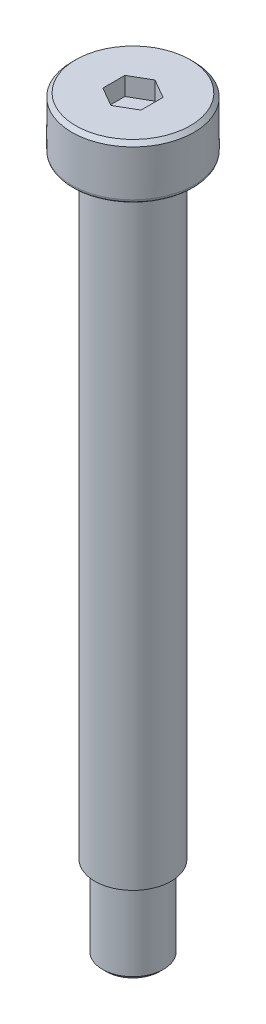
ISO-10303-21;
HEADER;
FILE_DESCRIPTION(('STEP AP214'),'2;1');
FILE_NAME('part.step','',(''),(''),'','','');
FILE_SCHEMA(('AUTOMOTIVE_DESIGN { 1 0 10303 214 1 1 1 1 }'));
ENDSEC;
DATA;
#1=APPLICATION_CONTEXT('core data for automotive mechanical design processes');
#2=APPLICATION_PROTOCOL_DEFINITION('international standard','automotive_design',2000,#1);
#3=PRODUCT_CONTEXT('',#1,'mechanical');
#4=PRODUCT('Part','Part','',(#3));
#5=PRODUCT_RELATED_PRODUCT_CATEGORY('part','',(#4));
#6=PRODUCT_DEFINITION_FORMATION('','',#4);
#7=PRODUCT_DEFINITION_CONTEXT('part definition',#1,'design');
#8=PRODUCT_DEFINITION('design','',#6,#7);
#9=PRODUCT_DEFINITION_SHAPE('','',#8);
#10=(LENGTH_UNIT() NAMED_UNIT(*) SI_UNIT(.MILLI.,.METRE.));
#11=(NAMED_UNIT(*) PLANE_ANGLE_UNIT() SI_UNIT($,.RADIAN.));
#12=(NAMED_UNIT(*) SI_UNIT($,.STERADIAN.) SOLID_ANGLE_UNIT());
#13=UNCERTAINTY_MEASURE_WITH_UNIT(LENGTH_MEASURE(1.E-05),#10,'distance_accuracy_value','');
#14=(GEOMETRIC_REPRESENTATION_CONTEXT(3) GLOBAL_UNCERTAINTY_ASSIGNED_CONTEXT((#13)) GLOBAL_UNIT_ASSIGNED_CONTEXT((#10,
#11,#12)) REPRESENTATION_CONTEXT('',''));
#15=CARTESIAN_POINT('',(0.,0.,0.));
#16=DIRECTION('',(0.,0.,1.));
#17=DIRECTION('',(1.,0.,0.));
#18=AXIS2_PLACEMENT_3D('',#15,#16,#17);
#19=CARTESIAN_POINT('',(0.,0.,0.));
#20=DIRECTION('',(0.,-1.,0.));
#21=DIRECTION('',(1.,0.,0.));
#22=AXIS2_PLACEMENT_3D('',#19,#20,#21);
#23=PLANE('',#22);
#24=CARTESIAN_POINT('',(0.,0.,0.));
#25=DIRECTION('',(0.,-1.,0.));
#26=DIRECTION('',(1.,0.,0.));
#27=AXIS2_PLACEMENT_3D('',#24,#25,#26);
#28=CIRCLE('',#27,7.50000000000002);
#29=CARTESIAN_POINT('',(7.50000000000002,0.,0.));
#30=VERTEX_POINT('',#29);
#31=EDGE_CURVE('E166',#30,#30,#28,.F.);
#32=ORIENTED_EDGE('',*,*,#31,.T.);
#33=EDGE_LOOP('',(#32));
#34=FACE_BOUND('',#33,.T.);
#35=DIRECTION('',(0.866025403784439,0.,-0.5));
#36=VECTOR('',#35,1.);
#37=CARTESIAN_POINT('',(0.,0.,2.88675134594813));
#38=LINE('',#37,#36);
#39=CARTESIAN_POINT('',(0.,0.,2.88675134594813));
#40=VERTEX_POINT('',#39);
#41=CARTESIAN_POINT('',(2.5,0.,1.44337567297407));
#42=VERTEX_POINT('',#41);
#43=EDGE_CURVE('E133',#40,#42,#38,.T.);
#44=ORIENTED_EDGE('',*,*,#43,.F.);
#45=DIRECTION('',(0.866025403784439,0.,0.5));
#46=VECTOR('',#45,1.);
#47=CARTESIAN_POINT('',(-2.5,0.,1.44337567297406));
#48=LINE('',#47,#46);
#49=CARTESIAN_POINT('',(-2.5,0.,1.44337567297406));
#50=VERTEX_POINT('',#49);
#51=EDGE_CURVE('E59',#50,#40,#48,.T.);
#52=ORIENTED_EDGE('',*,*,#51,.F.);
#53=DIRECTION('',(0.,0.,1.));
#54=VECTOR('',#53,1.);
#55=CARTESIAN_POINT('',(-2.5,0.,-1.44337567297407));
#56=LINE('',#55,#54);
#57=CARTESIAN_POINT('',(-2.5,0.,-1.44337567297407));
#58=VERTEX_POINT('',#57);
#59=EDGE_CURVE('E142',#58,#50,#56,.T.);
#60=ORIENTED_EDGE('',*,*,#59,.F.);
#61=DIRECTION('',(-0.866025403784439,0.,0.5));
#62=VECTOR('',#61,1.);
#63=CARTESIAN_POINT('',(0.,0.,-2.88675134594813));
#64=LINE('',#63,#62);
#65=CARTESIAN_POINT('',(0.,0.,-2.88675134594813));
#66=VERTEX_POINT('',#65);
#67=EDGE_CURVE('E140',#66,#58,#64,.T.);
#68=ORIENTED_EDGE('',*,*,#67,.F.);
#69=DIRECTION('',(-0.866025403784439,0.,-0.5));
#70=VECTOR('',#69,1.);
#71=CARTESIAN_POINT('',(2.5,0.,-1.44337567297407));
#72=LINE('',#71,#70);
#73=CARTESIAN_POINT('',(2.5,0.,-1.44337567297407));
#74=VERTEX_POINT('',#73);
#75=EDGE_CURVE('E107',#74,#66,#72,.T.);
#76=ORIENTED_EDGE('',*,*,#75,.F.);
#77=DIRECTION('',(0.,0.,-1.));
#78=VECTOR('',#77,1.);
#79=CARTESIAN_POINT('',(2.5,0.,1.44337567297407));
#80=LINE('',#79,#78);
#81=EDGE_CURVE('E136',#42,#74,#80,.T.);
#82=ORIENTED_EDGE('',*,*,#81,.F.);
#83=EDGE_LOOP('',(#44,#52,#60,#68,#76,#82));
#84=FACE_BOUND('',#83,.T.);
#85=ADVANCED_FACE('F43',(#34,#84),#23,.F.);
#86=CARTESIAN_POINT('',(0.,5.,0.));
#87=DIRECTION('',(0.,1.,0.));
#88=DIRECTION('',(-1.,0.,0.));
#89=AXIS2_PLACEMENT_3D('',#86,#87,#88);
#90=CYLINDRICAL_SURFACE('',#89,8.);
#91=CARTESIAN_POINT('',(0.,-6.50000000000001,0.));
#92=DIRECTION('',(0.,1.,0.));
#93=DIRECTION('',(-1.,0.,0.));
#94=AXIS2_PLACEMENT_3D('',#91,#92,#93);
#95=CIRCLE('',#94,8.);
#96=CARTESIAN_POINT('',(-8.,-6.50000000000001,0.));
#97=VERTEX_POINT('',#96);
#98=EDGE_CURVE('E172',#97,#97,#95,.T.);
#99=ORIENTED_EDGE('',*,*,#98,.T.);
#100=EDGE_LOOP('',(#99));
#101=FACE_BOUND('',#100,.T.);
#102=CARTESIAN_POINT('',(0.,-0.499999999999984,0.));
#103=DIRECTION('',(0.,-1.,0.));
#104=DIRECTION('',(1.,0.,0.));
#105=AXIS2_PLACEMENT_3D('',#102,#103,#104);
#106=CIRCLE('',#105,8.);
#107=CARTESIAN_POINT('',(8.,-0.499999999999983,0.));
#108=VERTEX_POINT('',#107);
#109=EDGE_CURVE('E169',#108,#108,#106,.T.);
#110=ORIENTED_EDGE('',*,*,#109,.T.);
#111=EDGE_LOOP('',(#110));
#112=FACE_BOUND('',#111,.T.);
#113=ADVANCED_FACE('F194',(#101,#112),#90,.T.);
#114=CARTESIAN_POINT('',(8.00000000000001,-7.,0.));
#115=DIRECTION('',(0.,1.,0.));
#116=DIRECTION('',(-1.,0.,0.));
#117=AXIS2_PLACEMENT_3D('',#114,#115,#116);
#118=PLANE('',#117);
#119=CARTESIAN_POINT('',(0.,-7.,0.));
#120=DIRECTION('',(0.,1.,0.));
#121=DIRECTION('',(-1.,0.,0.));
#122=AXIS2_PLACEMENT_3D('',#119,#120,#121);
#123=CIRCLE('',#122,7.5);
#124=CARTESIAN_POINT('',(-7.5,-7.00000000000001,0.));
#125=VERTEX_POINT('',#124);
#126=EDGE_CURVE('E175',#125,#125,#123,.F.);
#127=ORIENTED_EDGE('',*,*,#126,.T.);
#128=EDGE_LOOP('',(#127));
#129=FACE_BOUND('',#128,.T.);
#130=CARTESIAN_POINT('',(0.,-7.00000000000001,0.));
#131=DIRECTION('',(0.,1.,0.));
#132=DIRECTION('',(-1.,0.,0.));
#133=AXIS2_PLACEMENT_3D('',#130,#131,#132);
#134=CIRCLE('',#133,4.75);
#135=CARTESIAN_POINT('',(-4.75,-7.00000000000001,0.));
#136=VERTEX_POINT('',#135);
#137=EDGE_CURVE('E163',#136,#136,#134,.T.);
#138=ORIENTED_EDGE('',*,*,#137,.T.);
#139=EDGE_LOOP('',(#138));
#140=FACE_BOUND('',#139,.T.);
#141=ADVANCED_FACE('F202',(#129,#140),#118,.F.);
#142=CARTESIAN_POINT('',(0.,5.,0.));
#143=DIRECTION('',(0.,1.,0.));
#144=DIRECTION('',(-1.,0.,0.));
#145=AXIS2_PLACEMENT_3D('',#142,#143,#144);
#146=CYLINDRICAL_SURFACE('',#145,4.75);
#147=ORIENTED_EDGE('',*,*,#137,.F.);
#148=EDGE_LOOP('',(#147));
#149=FACE_BOUND('',#148,.T.);
#150=CARTESIAN_POINT('',(0.,-7.50000000000001,0.));
#151=DIRECTION('',(0.,1.,0.));
#152=DIRECTION('',(-1.,0.,0.));
#153=AXIS2_PLACEMENT_3D('',#150,#151,#152);
#154=CIRCLE('',#153,4.75);
#155=CARTESIAN_POINT('',(-4.75,-7.50000000000001,0.));
#156=VERTEX_POINT('',#155);
#157=EDGE_CURVE('E160',#156,#156,#154,.T.);
#158=ORIENTED_EDGE('',*,*,#157,.T.);
#159=EDGE_LOOP('',(#158));
#160=FACE_BOUND('',#159,.T.);
#161=ADVANCED_FACE('F256',(#149,#160),#146,.T.);
#162=CARTESIAN_POINT('',(4.75,-7.50000000000001,0.));
#163=DIRECTION('',(0.,-1.,0.));
#164=DIRECTION('',(1.,0.,0.));
#165=AXIS2_PLACEMENT_3D('',#162,#163,#164);
#166=PLANE('',#165);
#167=ORIENTED_EDGE('',*,*,#157,.F.);
#168=EDGE_LOOP('',(#167));
#169=FACE_BOUND('',#168,.T.);
#170=CARTESIAN_POINT('',(0.,-7.50000000000001,0.));
#171=DIRECTION('',(0.,1.,0.));
#172=DIRECTION('',(-1.,0.,0.));
#173=AXIS2_PLACEMENT_3D('',#170,#171,#172);
#174=CIRCLE('',#173,5.);
#175=CARTESIAN_POINT('',(-5.,-7.50000000000001,0.));
#176=VERTEX_POINT('',#175);
#177=EDGE_CURVE('E157',#176,#176,#174,.T.);
#178=ORIENTED_EDGE('',*,*,#177,.T.);
#179=EDGE_LOOP('',(#178));
#180=FACE_BOUND('',#179,.T.);
#181=ADVANCED_FACE('F252',(#169,#180),#166,.F.);
#182=CARTESIAN_POINT('',(0.,5.,0.));
#183=DIRECTION('',(0.,1.,0.));
#184=DIRECTION('',(-1.,0.,0.));
#185=AXIS2_PLACEMENT_3D('',#182,#183,#184);
#186=CYLINDRICAL_SURFACE('',#185,5.00000000000001);
#187=ORIENTED_EDGE('',*,*,#177,.F.);
#188=EDGE_LOOP('',(#187));
#189=FACE_BOUND('',#188,.T.);
#190=CARTESIAN_POINT('',(0.,-87.,0.));
#191=DIRECTION('',(0.,1.,0.));
#192=DIRECTION('',(-1.,0.,0.));
#193=AXIS2_PLACEMENT_3D('',#190,#191,#192);
#194=CIRCLE('',#193,5.00000000000002);
#195=CARTESIAN_POINT('',(-5.,-87.,0.));
#196=VERTEX_POINT('',#195);
#197=EDGE_CURVE('E154',#196,#196,#194,.T.);
#198=ORIENTED_EDGE('',*,*,#197,.T.);
#199=EDGE_LOOP('',(#198));
#200=FACE_BOUND('',#199,.T.);
#201=ADVANCED_FACE('F248',(#189,#200),#186,.T.);
#202=CARTESIAN_POINT('',(5.00000000000003,-87.,0.));
#203=DIRECTION('',(0.,1.,0.));
#204=DIRECTION('',(-1.,0.,0.));
#205=AXIS2_PLACEMENT_3D('',#202,#203,#204);
#206=PLANE('',#205);
#207=ORIENTED_EDGE('',*,*,#197,.F.);
#208=EDGE_LOOP('',(#207));
#209=FACE_BOUND('',#208,.T.);
#210=CARTESIAN_POINT('',(0.,-87.,0.));
#211=DIRECTION('',(0.,1.,0.));
#212=DIRECTION('',(-1.,0.,0.));
#213=AXIS2_PLACEMENT_3D('',#210,#211,#212);
#214=CIRCLE('',#213,4.);
#215=CARTESIAN_POINT('',(-3.99999999999999,-87.,0.));
#216=VERTEX_POINT('',#215);
#217=EDGE_CURVE('E146',#216,#216,#214,.T.);
#218=ORIENTED_EDGE('',*,*,#217,.T.);
#219=EDGE_LOOP('',(#218));
#220=FACE_BOUND('',#219,.T.);
#221=ADVANCED_FACE('F245',(#209,#220),#206,.F.);
#222=CARTESIAN_POINT('',(0.,5.,0.));
#223=DIRECTION('',(0.,1.,0.));
#224=DIRECTION('',(-1.,0.,0.));
#225=AXIS2_PLACEMENT_3D('',#222,#223,#224);
#226=CYLINDRICAL_SURFACE('',#225,4.);
#227=CARTESIAN_POINT('',(0.,-97.5,0.));
#228=DIRECTION('',(0.,1.,0.));
#229=DIRECTION('',(-1.,0.,0.));
#230=AXIS2_PLACEMENT_3D('',#227,#228,#229);
#231=CIRCLE('',#230,4.);
#232=CARTESIAN_POINT('',(-3.99999999999999,-97.5,0.));
#233=VERTEX_POINT('',#232);
#234=EDGE_CURVE('E52',#233,#233,#231,.T.);
#235=ORIENTED_EDGE('',*,*,#234,.T.);
#236=EDGE_LOOP('',(#235));
#237=FACE_BOUND('',#236,.T.);
#238=ORIENTED_EDGE('',*,*,#217,.F.);
#239=EDGE_LOOP('',(#238));
#240=FACE_BOUND('',#239,.T.);
#241=ADVANCED_FACE('F180',(#237,#240),#226,.T.);
#242=CARTESIAN_POINT('',(4.00000000000001,-98.,0.));
#243=DIRECTION('',(0.,1.,0.));
#244=DIRECTION('',(-1.,0.,0.));
#245=AXIS2_PLACEMENT_3D('',#242,#243,#244);
#246=PLANE('',#245);
#247=CARTESIAN_POINT('',(0.,-98.,0.));
#248=DIRECTION('',(0.,1.,0.));
#249=DIRECTION('',(-1.,0.,0.));
#250=AXIS2_PLACEMENT_3D('',#247,#248,#249);
#251=CIRCLE('',#250,3.5);
#252=CARTESIAN_POINT('',(-3.49999999999999,-98.,0.));
#253=VERTEX_POINT('',#252);
#254=EDGE_CURVE('E11',#253,#253,#251,.F.);
#255=ORIENTED_EDGE('',*,*,#254,.T.);
#256=EDGE_LOOP('',(#255));
#257=FACE_BOUND('',#256,.T.);
#258=ADVANCED_FACE('F240',(#257),#246,.F.);
#259=CARTESIAN_POINT('',(-2.5,-2.4,1.44337567297406));
#260=DIRECTION('',(-0.5,0.,0.866025403784439));
#261=DIRECTION('',(0.866025403784439,0.,0.5));
#262=AXIS2_PLACEMENT_3D('',#259,#260,#261);
#263=PLANE('',#262);
#264=ORIENTED_EDGE('',*,*,#51,.T.);
#265=DIRECTION('',(0.,1.,0.));
#266=VECTOR('',#265,1.);
#267=CARTESIAN_POINT('',(0.,-2.4,2.88675134594813));
#268=LINE('',#267,#266);
#269=CARTESIAN_POINT('',(0.,-2.4,2.88675134594813));
#270=VERTEX_POINT('',#269);
#271=EDGE_CURVE('E89',#270,#40,#268,.T.);
#272=ORIENTED_EDGE('',*,*,#271,.F.);
#273=DIRECTION('',(0.866025403784439,0.,0.5));
#274=VECTOR('',#273,1.);
#275=CARTESIAN_POINT('',(-2.5,-2.4,1.44337567297406));
#276=LINE('',#275,#274);
#277=CARTESIAN_POINT('',(-2.5,-2.4,1.44337567297406));
#278=VERTEX_POINT('',#277);
#279=EDGE_CURVE('E144',#278,#270,#276,.T.);
#280=ORIENTED_EDGE('',*,*,#279,.F.);
#281=DIRECTION('',(0.,1.,0.));
#282=VECTOR('',#281,1.);
#283=CARTESIAN_POINT('',(-2.5,-2.4,1.44337567297406));
#284=LINE('',#283,#282);
#285=EDGE_CURVE('E67',#278,#50,#284,.T.);
#286=ORIENTED_EDGE('',*,*,#285,.T.);
#287=EDGE_LOOP('',(#264,#272,#280,#286));
#288=FACE_BOUND('',#287,.T.);
#289=ADVANCED_FACE('F230',(#288),#263,.F.);
#290=CARTESIAN_POINT('',(-2.5,-2.4,-1.44337567297407));
#291=DIRECTION('',(-1.,0.,0.));
#292=DIRECTION('',(0.,-1.,0.));
#293=AXIS2_PLACEMENT_3D('',#290,#291,#292);
#294=PLANE('',#293);
#295=ORIENTED_EDGE('',*,*,#59,.T.);
#296=ORIENTED_EDGE('',*,*,#285,.F.);
#297=DIRECTION('',(0.,0.,1.));
#298=VECTOR('',#297,1.);
#299=CARTESIAN_POINT('',(-2.5,-2.4,-1.44337567297407));
#300=LINE('',#299,#298);
#301=CARTESIAN_POINT('',(-2.5,-2.4,-1.44337567297407));
#302=VERTEX_POINT('',#301);
#303=EDGE_CURVE('E119',#302,#278,#300,.T.);
#304=ORIENTED_EDGE('',*,*,#303,.F.);
#305=DIRECTION('',(0.,1.,0.));
#306=VECTOR('',#305,1.);
#307=CARTESIAN_POINT('',(-2.5,-2.4,-1.44337567297407));
#308=LINE('',#307,#306);
#309=EDGE_CURVE('E111',#302,#58,#308,.T.);
#310=ORIENTED_EDGE('',*,*,#309,.T.);
#311=EDGE_LOOP('',(#295,#296,#304,#310));
#312=FACE_BOUND('',#311,.T.);
#313=ADVANCED_FACE('F227',(#312),#294,.F.);
#314=CARTESIAN_POINT('',(0.,-2.4,-2.88675134594813));
#315=DIRECTION('',(-0.5,0.,-0.866025403784439));
#316=DIRECTION('',(-0.866025403784439,0.,0.5));
#317=AXIS2_PLACEMENT_3D('',#314,#315,#316);
#318=PLANE('',#317);
#319=ORIENTED_EDGE('',*,*,#67,.T.);
#320=ORIENTED_EDGE('',*,*,#309,.F.);
#321=DIRECTION('',(-0.866025403784439,0.,0.5));
#322=VECTOR('',#321,1.);
#323=CARTESIAN_POINT('',(0.,-2.4,-2.88675134594813));
#324=LINE('',#323,#322);
#325=CARTESIAN_POINT('',(0.,-2.4,-2.88675134594813));
#326=VERTEX_POINT('',#325);
#327=EDGE_CURVE('E115',#326,#302,#324,.T.);
#328=ORIENTED_EDGE('',*,*,#327,.F.);
#329=DIRECTION('',(0.,1.,0.));
#330=VECTOR('',#329,1.);
#331=CARTESIAN_POINT('',(0.,-2.4,-2.88675134594813));
#332=LINE('',#331,#330);
#333=EDGE_CURVE('E100',#326,#66,#332,.T.);
#334=ORIENTED_EDGE('',*,*,#333,.T.);
#335=EDGE_LOOP('',(#319,#320,#328,#334));
#336=FACE_BOUND('',#335,.T.);
#337=ADVANCED_FACE('F116',(#336),#318,.F.);
#338=CARTESIAN_POINT('',(2.5,-2.4,-1.44337567297407));
#339=DIRECTION('',(0.5,0.,-0.866025403784439));
#340=DIRECTION('',(-0.866025403784439,0.,-0.5));
#341=AXIS2_PLACEMENT_3D('',#338,#339,#340);
#342=PLANE('',#341);
#343=ORIENTED_EDGE('',*,*,#75,.T.);
#344=ORIENTED_EDGE('',*,*,#333,.F.);
#345=DIRECTION('',(-0.866025403784439,0.,-0.5));
#346=VECTOR('',#345,1.);
#347=CARTESIAN_POINT('',(2.5,-2.4,-1.44337567297407));
#348=LINE('',#347,#346);
#349=CARTESIAN_POINT('',(2.5,-2.4,-1.44337567297407));
#350=VERTEX_POINT('',#349);
#351=EDGE_CURVE('E104',#350,#326,#348,.T.);
#352=ORIENTED_EDGE('',*,*,#351,.F.);
#353=DIRECTION('',(0.,1.,0.));
#354=VECTOR('',#353,1.);
#355=CARTESIAN_POINT('',(2.5,-2.4,-1.44337567297407));
#356=LINE('',#355,#354);
#357=EDGE_CURVE('E112',#350,#74,#356,.T.);
#358=ORIENTED_EDGE('',*,*,#357,.T.);
#359=EDGE_LOOP('',(#343,#344,#352,#358));
#360=FACE_BOUND('',#359,.T.);
#361=ADVANCED_FACE('F102',(#360),#342,.F.);
#362=CARTESIAN_POINT('',(2.5,-2.4,1.44337567297407));
#363=DIRECTION('',(1.,0.,0.));
#364=DIRECTION('',(0.,0.,-1.));
#365=AXIS2_PLACEMENT_3D('',#362,#363,#364);
#366=PLANE('',#365);
#367=ORIENTED_EDGE('',*,*,#81,.T.);
#368=ORIENTED_EDGE('',*,*,#357,.F.);
#369=DIRECTION('',(0.,0.,-1.));
#370=VECTOR('',#369,1.);
#371=CARTESIAN_POINT('',(2.5,-2.4,1.44337567297407));
#372=LINE('',#371,#370);
#373=CARTESIAN_POINT('',(2.5,-2.4,1.44337567297407));
#374=VERTEX_POINT('',#373);
#375=EDGE_CURVE('E125',#374,#350,#372,.T.);
#376=ORIENTED_EDGE('',*,*,#375,.F.);
#377=DIRECTION('',(0.,1.,0.));
#378=VECTOR('',#377,1.);
#379=CARTESIAN_POINT('',(2.5,-2.4,1.44337567297407));
#380=LINE('',#379,#378);
#381=EDGE_CURVE('E149',#374,#42,#380,.T.);
#382=ORIENTED_EDGE('',*,*,#381,.T.);
#383=EDGE_LOOP('',(#367,#368,#376,#382));
#384=FACE_BOUND('',#383,.T.);
#385=ADVANCED_FACE('F223',(#384),#366,.F.);
#386=CARTESIAN_POINT('',(0.,-2.4,2.88675134594813));
#387=DIRECTION('',(0.5,0.,0.866025403784439));
#388=DIRECTION('',(0.866025403784439,0.,-0.5));
#389=AXIS2_PLACEMENT_3D('',#386,#387,#388);
#390=PLANE('',#389);
#391=ORIENTED_EDGE('',*,*,#43,.T.);
#392=ORIENTED_EDGE('',*,*,#381,.F.);
#393=DIRECTION('',(0.866025403784439,0.,-0.5));
#394=VECTOR('',#393,1.);
#395=CARTESIAN_POINT('',(0.,-2.4,2.88675134594813));
#396=LINE('',#395,#394);
#397=EDGE_CURVE('E127',#270,#374,#396,.T.);
#398=ORIENTED_EDGE('',*,*,#397,.F.);
#399=ORIENTED_EDGE('',*,*,#271,.T.);
#400=EDGE_LOOP('',(#391,#392,#398,#399));
#401=FACE_BOUND('',#400,.T.);
#402=ADVANCED_FACE('F214',(#401),#390,.F.);
#403=CARTESIAN_POINT('',(0.,-2.4,0.));
#404=DIRECTION('',(0.,1.,0.));
#405=DIRECTION('',(-1.,0.,0.));
#406=AXIS2_PLACEMENT_3D('',#403,#404,#405);
#407=PLANE('',#406);
#408=ORIENTED_EDGE('',*,*,#279,.T.);
#409=ORIENTED_EDGE('',*,*,#397,.T.);
#410=ORIENTED_EDGE('',*,*,#375,.T.);
#411=ORIENTED_EDGE('',*,*,#351,.T.);
#412=ORIENTED_EDGE('',*,*,#327,.T.);
#413=ORIENTED_EDGE('',*,*,#303,.T.);
#414=EDGE_LOOP('',(#408,#409,#410,#411,#412,#413));
#415=FACE_BOUND('',#414,.T.);
#416=ADVANCED_FACE('F122',(#415),#407,.T.);
#417=CARTESIAN_POINT('',(0.,0.,0.));
#418=DIRECTION('',(0.,-1.,0.));
#419=DIRECTION('',(1.,0.,0.));
#420=AXIS2_PLACEMENT_3D('',#417,#418,#419);
#421=CONICAL_SURFACE('',#420,7.50000000000002,0.785398163397448);
#422=ORIENTED_EDGE('',*,*,#109,.F.);
#423=EDGE_LOOP('',(#422));
#424=FACE_BOUND('',#423,.T.);
#425=ORIENTED_EDGE('',*,*,#31,.F.);
#426=EDGE_LOOP('',(#425));
#427=FACE_BOUND('',#426,.T.);
#428=ADVANCED_FACE('F190',(#424,#427),#421,.T.);
#429=CARTESIAN_POINT('',(0.,-6.50000000000001,0.));
#430=DIRECTION('',(0.,1.,0.));
#431=DIRECTION('',(-1.,0.,0.));
#432=AXIS2_PLACEMENT_3D('',#429,#430,#431);
#433=TOROIDAL_SURFACE('',#432,7.5,0.5);
#434=ORIENTED_EDGE('',*,*,#126,.F.);
#435=EDGE_LOOP('',(#434));
#436=FACE_BOUND('',#435,.T.);
#437=ORIENTED_EDGE('',*,*,#98,.F.);
#438=EDGE_LOOP('',(#437));
#439=FACE_BOUND('',#438,.T.);
#440=ADVANCED_FACE('F184',(#436,#439),#433,.T.);
#441=CARTESIAN_POINT('',(0.,-97.5,0.));
#442=DIRECTION('',(0.,1.,0.));
#443=DIRECTION('',(-1.,0.,0.));
#444=AXIS2_PLACEMENT_3D('',#441,#442,#443);
#445=CONICAL_SURFACE('',#444,4.,0.78539816339746);
#446=ORIENTED_EDGE('',*,*,#254,.F.);
#447=EDGE_LOOP('',(#446));
#448=FACE_BOUND('',#447,.T.);
#449=ORIENTED_EDGE('',*,*,#234,.F.);
#450=EDGE_LOOP('',(#449));
#451=FACE_BOUND('',#450,.T.);
#452=ADVANCED_FACE('F46',(#448,#451),#445,.T.);
#453=CLOSED_SHELL('',(#85,#113,#141,#161,#181,#201,#221,#241,#258,#289,#313,#337,#361,#385,#402,
#416,#428,#440,#452));
#454=MANIFOLD_SOLID_BREP('B2',#453);
#455=ADVANCED_BREP_SHAPE_REPRESENTATION('',(#18,#454),#14);
#456=SHAPE_DEFINITION_REPRESENTATION(#9,#455);
ENDSEC;
END-ISO-10303-21;
